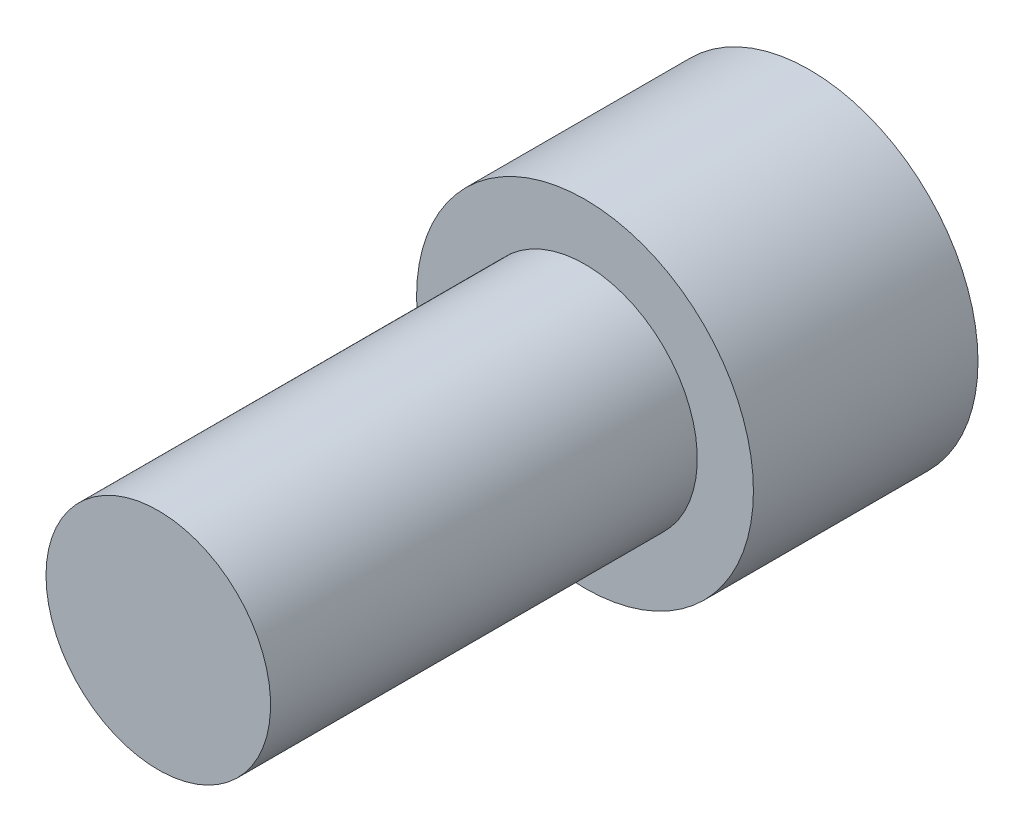
ISO-10303-21;
HEADER;
FILE_DESCRIPTION(('STEP AP214'),'2;1');
FILE_NAME('part.step','',(''),(''),'','','');
FILE_SCHEMA(('AUTOMOTIVE_DESIGN { 1 0 10303 214 1 1 1 1 }'));
ENDSEC;
DATA;
#1=APPLICATION_CONTEXT('core data for automotive mechanical design processes');
#2=APPLICATION_PROTOCOL_DEFINITION('international standard','automotive_design',2000,#1);
#3=PRODUCT_CONTEXT('',#1,'mechanical');
#4=PRODUCT('Part','Part','',(#3));
#5=PRODUCT_RELATED_PRODUCT_CATEGORY('part','',(#4));
#6=PRODUCT_DEFINITION_FORMATION('','',#4);
#7=PRODUCT_DEFINITION_CONTEXT('part definition',#1,'design');
#8=PRODUCT_DEFINITION('design','',#6,#7);
#9=PRODUCT_DEFINITION_SHAPE('','',#8);
#10=(LENGTH_UNIT() NAMED_UNIT(*) SI_UNIT(.MILLI.,.METRE.));
#11=(NAMED_UNIT(*) PLANE_ANGLE_UNIT() SI_UNIT($,.RADIAN.));
#12=(NAMED_UNIT(*) SI_UNIT($,.STERADIAN.) SOLID_ANGLE_UNIT());
#13=UNCERTAINTY_MEASURE_WITH_UNIT(LENGTH_MEASURE(1.E-05),#10,'distance_accuracy_value','');
#14=(GEOMETRIC_REPRESENTATION_CONTEXT(3) GLOBAL_UNCERTAINTY_ASSIGNED_CONTEXT((#13)) GLOBAL_UNIT_ASSIGNED_CONTEXT((#10,
#11,#12)) REPRESENTATION_CONTEXT('',''));
#15=CARTESIAN_POINT('',(0.,0.,0.));
#16=DIRECTION('',(0.,0.,1.));
#17=DIRECTION('',(1.,0.,0.));
#18=AXIS2_PLACEMENT_3D('',#15,#16,#17);
#19=CARTESIAN_POINT('',(0.,0.,29.));
#20=DIRECTION('',(0.,0.,-1.));
#21=DIRECTION('',(-1.,0.,0.));
#22=AXIS2_PLACEMENT_3D('',#19,#20,#21);
#23=CYLINDRICAL_SURFACE('',#22,5.);
#24=CARTESIAN_POINT('',(0.,0.,29.));
#25=DIRECTION('',(0.,0.,-1.));
#26=DIRECTION('',(-1.,0.,0.));
#27=AXIS2_PLACEMENT_3D('',#24,#25,#26);
#28=CIRCLE('',#27,5.);
#29=CARTESIAN_POINT('',(-5.,0.,29.));
#30=VERTEX_POINT('',#29);
#31=EDGE_CURVE('E45',#30,#30,#28,.F.);
#32=ORIENTED_EDGE('',*,*,#31,.F.);
#33=EDGE_LOOP('',(#32));
#34=FACE_BOUND('',#33,.T.);
#35=CARTESIAN_POINT('',(0.,0.,10.));
#36=DIRECTION('',(0.,0.,-1.));
#37=DIRECTION('',(-1.,0.,0.));
#38=AXIS2_PLACEMENT_3D('',#35,#36,#37);
#39=CIRCLE('',#38,5.);
#40=CARTESIAN_POINT('',(-5.,0.,10.));
#41=VERTEX_POINT('',#40);
#42=EDGE_CURVE('E11',#41,#41,#39,.T.);
#43=ORIENTED_EDGE('',*,*,#42,.F.);
#44=EDGE_LOOP('',(#43));
#45=FACE_BOUND('',#44,.T.);
#46=ADVANCED_FACE('F39',(#34,#45),#23,.T.);
#47=CARTESIAN_POINT('',(0.,0.,10.));
#48=DIRECTION('',(0.,0.,1.));
#49=DIRECTION('',(1.,0.,0.));
#50=AXIS2_PLACEMENT_3D('',#47,#48,#49);
#51=PLANE('',#50);
#52=ORIENTED_EDGE('',*,*,#42,.T.);
#53=EDGE_LOOP('',(#52));
#54=FACE_BOUND('',#53,.T.);
#55=ADVANCED_FACE('F55',(#54),#51,.F.);
#56=CARTESIAN_POINT('',(0.,0.,29.));
#57=DIRECTION('',(0.,0.,-1.));
#58=DIRECTION('',(-1.,0.,0.));
#59=AXIS2_PLACEMENT_3D('',#56,#57,#58);
#60=PLANE('',#59);
#61=ORIENTED_EDGE('',*,*,#31,.T.);
#62=EDGE_LOOP('',(#61));
#63=FACE_BOUND('',#62,.T.);
#64=ADVANCED_FACE('F51',(#63),#60,.F.);
#65=CLOSED_SHELL('',(#46,#55,#64));
#66=MANIFOLD_SOLID_BREP('B2',#65);
#67=CARTESIAN_POINT('',(0.,0.,250.));
#68=DIRECTION('',(0.,0.,-1.));
#69=DIRECTION('',(-1.,0.,0.));
#70=AXIS2_PLACEMENT_3D('',#67,#68,#69);
#71=CYLINDRICAL_SURFACE('',#70,7.5);
#72=CARTESIAN_POINT('',(0.,0.,10.));
#73=DIRECTION('',(0.,0.,-1.));
#74=DIRECTION('',(-1.,0.,0.));
#75=AXIS2_PLACEMENT_3D('',#72,#73,#74);
#76=CIRCLE('',#75,7.5);
#77=CARTESIAN_POINT('',(-7.5,0.,10.));
#78=VERTEX_POINT('',#77);
#79=EDGE_CURVE('E89',#78,#78,#76,.T.);
#80=ORIENTED_EDGE('',*,*,#79,.T.);
#81=EDGE_LOOP('',(#80));
#82=FACE_BOUND('',#81,.T.);
#83=CARTESIAN_POINT('',(0.,0.,0.));
#84=DIRECTION('',(0.,0.,1.));
#85=DIRECTION('',(1.,0.,0.));
#86=AXIS2_PLACEMENT_3D('',#83,#84,#85);
#87=CIRCLE('',#86,7.5);
#88=CARTESIAN_POINT('',(7.5,0.,0.));
#89=VERTEX_POINT('',#88);
#90=EDGE_CURVE('E38',#89,#89,#87,.T.);
#91=ORIENTED_EDGE('',*,*,#90,.T.);
#92=EDGE_LOOP('',(#91));
#93=FACE_BOUND('',#92,.T.);
#94=ADVANCED_FACE('F79',(#82,#93),#71,.T.);
#95=CARTESIAN_POINT('',(0.,0.,0.));
#96=DIRECTION('',(0.,0.,1.));
#97=DIRECTION('',(1.,0.,0.));
#98=AXIS2_PLACEMENT_3D('',#95,#96,#97);
#99=PLANE('',#98);
#100=CARTESIAN_POINT('',(0.,0.,0.));
#101=DIRECTION('',(0.,0.,1.));
#102=DIRECTION('',(1.,0.,0.));
#103=AXIS2_PLACEMENT_3D('',#100,#101,#102);
#104=CIRCLE('',#103,5.);
#105=CARTESIAN_POINT('',(5.,0.,0.));
#106=VERTEX_POINT('',#105);
#107=EDGE_CURVE('E85',#106,#106,#104,.T.);
#108=ORIENTED_EDGE('',*,*,#107,.T.);
#109=EDGE_LOOP('',(#108));
#110=FACE_BOUND('',#109,.T.);
#111=ORIENTED_EDGE('',*,*,#90,.F.);
#112=EDGE_LOOP('',(#111));
#113=FACE_BOUND('',#112,.T.);
#114=ADVANCED_FACE('F105',(#110,#113),#99,.F.);
#115=CARTESIAN_POINT('',(0.,0.,10.));
#116=DIRECTION('',(0.,0.,-1.));
#117=DIRECTION('',(-1.,0.,0.));
#118=AXIS2_PLACEMENT_3D('',#115,#116,#117);
#119=CYLINDRICAL_SURFACE('',#118,5.);
#120=CARTESIAN_POINT('',(0.,0.,10.));
#121=DIRECTION('',(0.,0.,-1.));
#122=DIRECTION('',(-1.,0.,0.));
#123=AXIS2_PLACEMENT_3D('',#120,#121,#122);
#124=CIRCLE('',#123,5.);
#125=CARTESIAN_POINT('',(-5.,0.,10.));
#126=VERTEX_POINT('',#125);
#127=EDGE_CURVE('E93',#126,#126,#124,.T.);
#128=ORIENTED_EDGE('',*,*,#127,.F.);
#129=EDGE_LOOP('',(#128));
#130=FACE_BOUND('',#129,.T.);
#131=ORIENTED_EDGE('',*,*,#107,.F.);
#132=EDGE_LOOP('',(#131));
#133=FACE_BOUND('',#132,.T.);
#134=ADVANCED_FACE('F102',(#130,#133),#119,.F.);
#135=CARTESIAN_POINT('',(0.,0.,10.));
#136=DIRECTION('',(0.,0.,-1.));
#137=DIRECTION('',(-1.,0.,0.));
#138=AXIS2_PLACEMENT_3D('',#135,#136,#137);
#139=PLANE('',#138);
#140=ORIENTED_EDGE('',*,*,#127,.T.);
#141=EDGE_LOOP('',(#140));
#142=FACE_BOUND('',#141,.T.);
#143=ORIENTED_EDGE('',*,*,#79,.F.);
#144=EDGE_LOOP('',(#143));
#145=FACE_BOUND('',#144,.T.);
#146=ADVANCED_FACE('F99',(#142,#145),#139,.F.);
#147=CLOSED_SHELL('',(#94,#114,#134,#146));
#148=MANIFOLD_SOLID_BREP('B6',#147);
#149=ADVANCED_BREP_SHAPE_REPRESENTATION('',(#18,#66,#148),#14);
#150=SHAPE_DEFINITION_REPRESENTATION(#9,#149);
ENDSEC;
END-ISO-10303-21;
